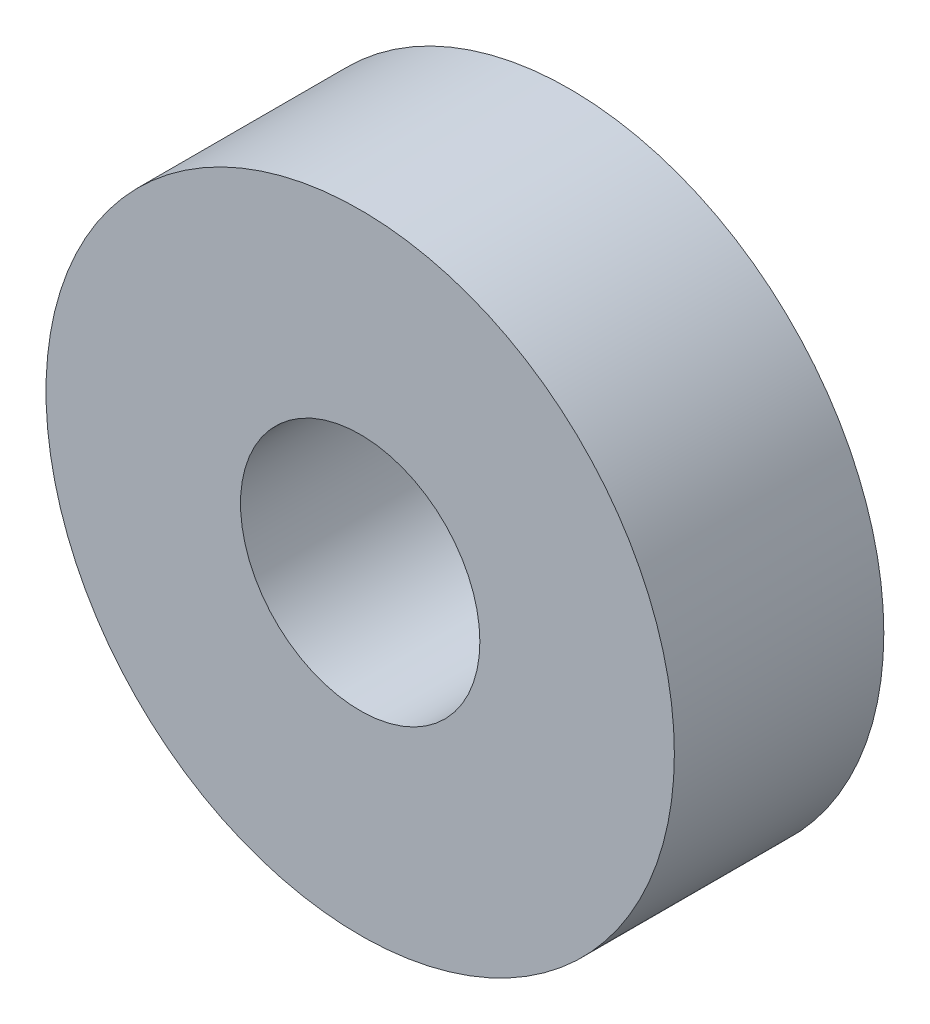
ISO-10303-21;
HEADER;
FILE_DESCRIPTION(('STEP AP214'),'2;1');
FILE_NAME('part.step','',(''),(''),'','','');
FILE_SCHEMA(('AUTOMOTIVE_DESIGN { 1 0 10303 214 1 1 1 1 }'));
ENDSEC;
DATA;
#1=APPLICATION_CONTEXT('core data for automotive mechanical design processes');
#2=APPLICATION_PROTOCOL_DEFINITION('international standard','automotive_design',2000,#1);
#3=PRODUCT_CONTEXT('',#1,'mechanical');
#4=PRODUCT('Part','Part','',(#3));
#5=PRODUCT_RELATED_PRODUCT_CATEGORY('part','',(#4));
#6=PRODUCT_DEFINITION_FORMATION('','',#4);
#7=PRODUCT_DEFINITION_CONTEXT('part definition',#1,'design');
#8=PRODUCT_DEFINITION('design','',#6,#7);
#9=PRODUCT_DEFINITION_SHAPE('','',#8);
#10=(LENGTH_UNIT() NAMED_UNIT(*) SI_UNIT(.MILLI.,.METRE.));
#11=(NAMED_UNIT(*) PLANE_ANGLE_UNIT() SI_UNIT($,.RADIAN.));
#12=(NAMED_UNIT(*) SI_UNIT($,.STERADIAN.) SOLID_ANGLE_UNIT());
#13=UNCERTAINTY_MEASURE_WITH_UNIT(LENGTH_MEASURE(1.E-05),#10,'distance_accuracy_value','');
#14=(GEOMETRIC_REPRESENTATION_CONTEXT(3) GLOBAL_UNCERTAINTY_ASSIGNED_CONTEXT((#13)) GLOBAL_UNIT_ASSIGNED_CONTEXT((#10,
#11,#12)) REPRESENTATION_CONTEXT('',''));
#15=CARTESIAN_POINT('',(0.,0.,0.));
#16=DIRECTION('',(0.,0.,1.));
#17=DIRECTION('',(1.,0.,0.));
#18=AXIS2_PLACEMENT_3D('',#15,#16,#17);
#19=CARTESIAN_POINT('',(0.,0.,7.));
#20=DIRECTION('',(0.,0.,1.));
#21=DIRECTION('',(1.,0.,0.));
#22=AXIS2_PLACEMENT_3D('',#19,#20,#21);
#23=PLANE('',#22);
#24=CARTESIAN_POINT('',(0.,0.,7.));
#25=DIRECTION('',(0.,0.,1.));
#26=DIRECTION('',(1.,0.,0.));
#27=AXIS2_PLACEMENT_3D('',#24,#25,#26);
#28=CIRCLE('',#27,10.5);
#29=CARTESIAN_POINT('',(10.5,0.,7.));
#30=VERTEX_POINT('',#29);
#31=EDGE_CURVE('E10',#30,#30,#28,.T.);
#32=ORIENTED_EDGE('',*,*,#31,.T.);
#33=EDGE_LOOP('',(#32));
#34=FACE_BOUND('',#33,.T.);
#35=CARTESIAN_POINT('',(0.,0.,7.));
#36=DIRECTION('',(0.,0.,1.));
#37=DIRECTION('',(1.,0.,0.));
#38=AXIS2_PLACEMENT_3D('',#35,#36,#37);
#39=CIRCLE('',#38,4.);
#40=CARTESIAN_POINT('',(4.,0.,7.));
#41=VERTEX_POINT('',#40);
#42=EDGE_CURVE('E52',#41,#41,#39,.T.);
#43=ORIENTED_EDGE('',*,*,#42,.F.);
#44=EDGE_LOOP('',(#43));
#45=FACE_BOUND('',#44,.T.);
#46=ADVANCED_FACE('F41',(#34,#45),#23,.T.);
#47=CARTESIAN_POINT('',(0.,0.,0.));
#48=DIRECTION('',(0.,0.,1.));
#49=DIRECTION('',(1.,0.,0.));
#50=AXIS2_PLACEMENT_3D('',#47,#48,#49);
#51=PLANE('',#50);
#52=CARTESIAN_POINT('',(0.,0.,0.));
#53=DIRECTION('',(0.,0.,1.));
#54=DIRECTION('',(1.,0.,0.));
#55=AXIS2_PLACEMENT_3D('',#52,#53,#54);
#56=CIRCLE('',#55,10.5);
#57=CARTESIAN_POINT('',(10.5,0.,0.));
#58=VERTEX_POINT('',#57);
#59=EDGE_CURVE('E45',#58,#58,#56,.T.);
#60=ORIENTED_EDGE('',*,*,#59,.F.);
#61=EDGE_LOOP('',(#60));
#62=FACE_BOUND('',#61,.T.);
#63=CARTESIAN_POINT('',(0.,0.,0.));
#64=DIRECTION('',(0.,0.,1.));
#65=DIRECTION('',(1.,0.,0.));
#66=AXIS2_PLACEMENT_3D('',#63,#64,#65);
#67=CIRCLE('',#66,4.);
#68=CARTESIAN_POINT('',(4.,0.,0.));
#69=VERTEX_POINT('',#68);
#70=EDGE_CURVE('E54',#69,#69,#67,.T.);
#71=ORIENTED_EDGE('',*,*,#70,.T.);
#72=EDGE_LOOP('',(#71));
#73=FACE_BOUND('',#72,.T.);
#74=ADVANCED_FACE('F64',(#62,#73),#51,.F.);
#75=CARTESIAN_POINT('',(0.,0.,7.));
#76=DIRECTION('',(0.,0.,-1.));
#77=DIRECTION('',(-1.,0.,0.));
#78=AXIS2_PLACEMENT_3D('',#75,#76,#77);
#79=CYLINDRICAL_SURFACE('',#78,10.5);
#80=ORIENTED_EDGE('',*,*,#31,.F.);
#81=EDGE_LOOP('',(#80));
#82=FACE_BOUND('',#81,.T.);
#83=ORIENTED_EDGE('',*,*,#59,.T.);
#84=EDGE_LOOP('',(#83));
#85=FACE_BOUND('',#84,.T.);
#86=ADVANCED_FACE('F43',(#82,#85),#79,.T.);
#87=CARTESIAN_POINT('',(0.,0.,7.));
#88=DIRECTION('',(0.,0.,-1.));
#89=DIRECTION('',(-1.,0.,0.));
#90=AXIS2_PLACEMENT_3D('',#87,#88,#89);
#91=CYLINDRICAL_SURFACE('',#90,4.);
#92=ORIENTED_EDGE('',*,*,#42,.T.);
#93=EDGE_LOOP('',(#92));
#94=FACE_BOUND('',#93,.T.);
#95=ORIENTED_EDGE('',*,*,#70,.F.);
#96=EDGE_LOOP('',(#95));
#97=FACE_BOUND('',#96,.T.);
#98=ADVANCED_FACE('F60',(#94,#97),#91,.F.);
#99=CLOSED_SHELL('',(#46,#74,#86,#98));
#100=MANIFOLD_SOLID_BREP('B2',#99);
#101=ADVANCED_BREP_SHAPE_REPRESENTATION('',(#18,#100),#14);
#102=SHAPE_DEFINITION_REPRESENTATION(#9,#101);
ENDSEC;
END-ISO-10303-21;
